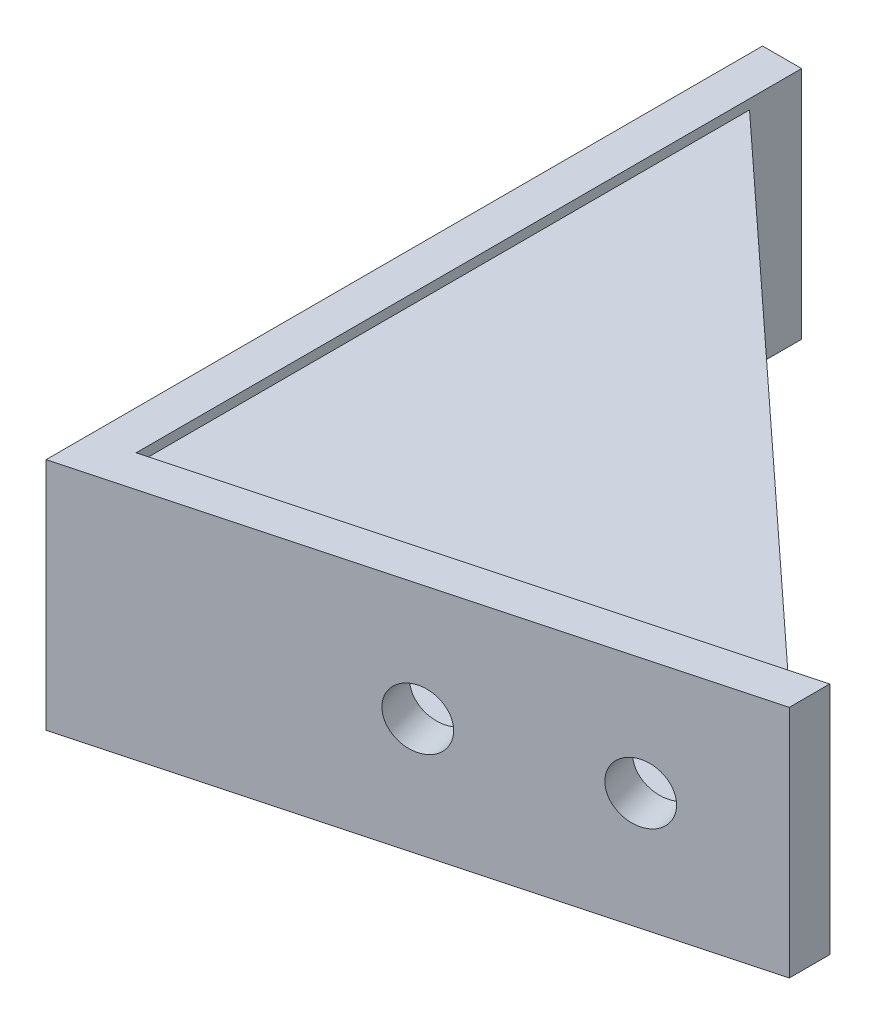
ISO-10303-21;
HEADER;
FILE_DESCRIPTION(('STEP AP214'),'2;1');
FILE_NAME('part.step','',(''),(''),'','','');
FILE_SCHEMA(('AUTOMOTIVE_DESIGN { 1 0 10303 214 1 1 1 1 }'));
ENDSEC;
DATA;
#1=APPLICATION_CONTEXT('core data for automotive mechanical design processes');
#2=APPLICATION_PROTOCOL_DEFINITION('international standard','automotive_design',2000,#1);
#3=PRODUCT_CONTEXT('',#1,'mechanical');
#4=PRODUCT('Part','Part','',(#3));
#5=PRODUCT_RELATED_PRODUCT_CATEGORY('part','',(#4));
#6=PRODUCT_DEFINITION_FORMATION('','',#4);
#7=PRODUCT_DEFINITION_CONTEXT('part definition',#1,'design');
#8=PRODUCT_DEFINITION('design','',#6,#7);
#9=PRODUCT_DEFINITION_SHAPE('','',#8);
#10=(LENGTH_UNIT() NAMED_UNIT(*) SI_UNIT(.MILLI.,.METRE.));
#11=(NAMED_UNIT(*) PLANE_ANGLE_UNIT() SI_UNIT($,.RADIAN.));
#12=(NAMED_UNIT(*) SI_UNIT($,.STERADIAN.) SOLID_ANGLE_UNIT());
#13=UNCERTAINTY_MEASURE_WITH_UNIT(LENGTH_MEASURE(1.E-05),#10,'distance_accuracy_value','');
#14=(GEOMETRIC_REPRESENTATION_CONTEXT(3) GLOBAL_UNCERTAINTY_ASSIGNED_CONTEXT((#13)) GLOBAL_UNIT_ASSIGNED_CONTEXT((#10,
#11,#12)) REPRESENTATION_CONTEXT('',''));
#15=CARTESIAN_POINT('',(0.,0.,0.));
#16=DIRECTION('',(0.,0.,1.));
#17=DIRECTION('',(1.,0.,0.));
#18=AXIS2_PLACEMENT_3D('',#15,#16,#17);
#19=CARTESIAN_POINT('',(82.379679526292,11.5,1934.81014608));
#20=DIRECTION('',(0.,1.,0.));
#21=DIRECTION('',(1.,0.,0.));
#22=AXIS2_PLACEMENT_3D('',#19,#20,#21);
#23=PLANE('',#22);
#24=DIRECTION('',(0.,0.,1.));
#25=VECTOR('',#24,1.);
#26=CARTESIAN_POINT('',(56.,11.5,1881.205080758));
#27=LINE('',#26,#25);
#28=CARTESIAN_POINT('',(56.,11.5,1881.205080758));
#29=VERTEX_POINT('',#28);
#30=CARTESIAN_POINT('',(56.,11.5,1975.385728521));
#31=VERTEX_POINT('',#30);
#32=EDGE_CURVE('E242',#29,#31,#27,.T.);
#33=ORIENTED_EDGE('',*,*,#32,.F.);
#34=DIRECTION('',(-0.734388245571344,0.,-0.678729625673318));
#35=VECTOR('',#34,1.);
#36=CARTESIAN_POINT('',(135.,11.5,1954.217742319));
#37=LINE('',#36,#35);
#38=CARTESIAN_POINT('',(135.,11.5,1954.217742319));
#39=VERTEX_POINT('',#38);
#40=EDGE_CURVE('E11',#39,#29,#37,.T.);
#41=ORIENTED_EDGE('',*,*,#40,.F.);
#42=DIRECTION('',(0.965925826288944,0.,-0.258819045102985));
#43=VECTOR('',#42,1.);
#44=CARTESIAN_POINT('',(56.,11.5,1975.385728521));
#45=LINE('',#44,#43);
#46=EDGE_CURVE('E264',#31,#39,#45,.T.);
#47=ORIENTED_EDGE('',*,*,#46,.F.);
#48=EDGE_LOOP('',(#33,#41,#47));
#49=FACE_BOUND('',#48,.T.);
#50=ADVANCED_FACE('F17',(#49),#23,.F.);
#51=CARTESIAN_POINT('',(135.,11.5,1954.217742319));
#52=DIRECTION('',(-0.678729625673318,0.,0.734388245571344));
#53=DIRECTION('',(0.,1.,0.));
#54=AXIS2_PLACEMENT_3D('',#51,#52,#53);
#55=PLANE('',#54);
#56=ORIENTED_EDGE('',*,*,#40,.T.);
#57=DIRECTION('',(0.,1.,0.));
#58=VECTOR('',#57,1.);
#59=CARTESIAN_POINT('',(56.,11.5,1881.205080758));
#60=LINE('',#59,#58);
#61=CARTESIAN_POINT('',(56.,16.5,1881.205080758));
#62=VERTEX_POINT('',#61);
#63=EDGE_CURVE('E238',#29,#62,#60,.T.);
#64=ORIENTED_EDGE('',*,*,#63,.T.);
#65=DIRECTION('',(-0.734388245571344,0.,-0.678729625673318));
#66=VECTOR('',#65,1.);
#67=CARTESIAN_POINT('',(135.,16.5,1954.217742319));
#68=LINE('',#67,#66);
#69=CARTESIAN_POINT('',(135.,16.5,1954.217742319));
#70=VERTEX_POINT('',#69);
#71=EDGE_CURVE('E20',#70,#62,#68,.T.);
#72=ORIENTED_EDGE('',*,*,#71,.F.);
#73=DIRECTION('',(0.,1.,0.));
#74=VECTOR('',#73,1.);
#75=CARTESIAN_POINT('',(135.,11.5,1954.217742319));
#76=LINE('',#75,#74);
#77=EDGE_CURVE('E268',#39,#70,#76,.T.);
#78=ORIENTED_EDGE('',*,*,#77,.F.);
#79=EDGE_LOOP('',(#56,#64,#72,#78));
#80=FACE_BOUND('',#79,.T.);
#81=ADVANCED_FACE('F396',(#80),#55,.F.);
#82=CARTESIAN_POINT('',(82.379679526292,-11.5,1934.81014608));
#83=DIRECTION('',(0.,1.,0.));
#84=DIRECTION('',(1.,0.,0.));
#85=AXIS2_PLACEMENT_3D('',#82,#83,#84);
#86=PLANE('',#85);
#87=DIRECTION('',(0.965925826288944,0.,-0.258819045102985));
#88=VECTOR('',#87,1.);
#89=CARTESIAN_POINT('',(56.,-11.5,1975.385728521));
#90=LINE('',#89,#88);
#91=CARTESIAN_POINT('',(56.,-11.5,1975.385728521));
#92=VERTEX_POINT('',#91);
#93=CARTESIAN_POINT('',(135.,-11.5,1954.217742319));
#94=VERTEX_POINT('',#93);
#95=EDGE_CURVE('E259',#92,#94,#90,.T.);
#96=ORIENTED_EDGE('',*,*,#95,.T.);
#97=DIRECTION('',(-0.734388245571344,0.,-0.678729625673318));
#98=VECTOR('',#97,1.);
#99=CARTESIAN_POINT('',(135.,-11.5,1954.217742319));
#100=LINE('',#99,#98);
#101=CARTESIAN_POINT('',(56.,-11.5,1881.205080758));
#102=VERTEX_POINT('',#101);
#103=EDGE_CURVE('E48',#94,#102,#100,.T.);
#104=ORIENTED_EDGE('',*,*,#103,.T.);
#105=DIRECTION('',(0.,0.,1.));
#106=VECTOR('',#105,1.);
#107=CARTESIAN_POINT('',(56.,-11.5,1881.205080758));
#108=LINE('',#107,#106);
#109=EDGE_CURVE('E275',#102,#92,#108,.T.);
#110=ORIENTED_EDGE('',*,*,#109,.T.);
#111=EDGE_LOOP('',(#96,#104,#110));
#112=FACE_BOUND('',#111,.T.);
#113=ADVANCED_FACE('F402',(#112),#86,.T.);
#114=CARTESIAN_POINT('',(82.379679526292,16.5,1934.81014608));
#115=DIRECTION('',(0.,1.,0.));
#116=DIRECTION('',(1.,0.,0.));
#117=AXIS2_PLACEMENT_3D('',#114,#115,#116);
#118=PLANE('',#117);
#119=DIRECTION('',(0.965925826288944,0.,-0.258819045102985));
#120=VECTOR('',#119,1.);
#121=CARTESIAN_POINT('',(56.,16.5,1975.385728521));
#122=LINE('',#121,#120);
#123=CARTESIAN_POINT('',(56.,16.5,1975.385728521));
#124=VERTEX_POINT('',#123);
#125=EDGE_CURVE('E224',#124,#70,#122,.T.);
#126=ORIENTED_EDGE('',*,*,#125,.T.);
#127=ORIENTED_EDGE('',*,*,#71,.T.);
#128=DIRECTION('',(0.,0.,1.));
#129=VECTOR('',#128,1.);
#130=CARTESIAN_POINT('',(56.,16.5,1881.205080758));
#131=LINE('',#130,#129);
#132=EDGE_CURVE('E194',#62,#124,#131,.T.);
#133=ORIENTED_EDGE('',*,*,#132,.T.);
#134=EDGE_LOOP('',(#126,#127,#133));
#135=FACE_BOUND('',#134,.T.);
#136=ADVANCED_FACE('F418',(#135),#118,.T.);
#137=CARTESIAN_POINT('',(135.,-16.5,1954.217742319));
#138=DIRECTION('',(-0.678729625673318,0.,0.734388245571344));
#139=DIRECTION('',(0.,1.,0.));
#140=AXIS2_PLACEMENT_3D('',#137,#138,#139);
#141=PLANE('',#140);
#142=DIRECTION('',(-0.734388245571344,0.,-0.678729625673318));
#143=VECTOR('',#142,1.);
#144=CARTESIAN_POINT('',(135.,-16.5,1954.217742319));
#145=LINE('',#144,#143);
#146=CARTESIAN_POINT('',(135.,-16.5,1954.217742319));
#147=VERTEX_POINT('',#146);
#148=CARTESIAN_POINT('',(56.,-16.5,1881.205080758));
#149=VERTEX_POINT('',#148);
#150=EDGE_CURVE('E38',#147,#149,#145,.T.);
#151=ORIENTED_EDGE('',*,*,#150,.T.);
#152=DIRECTION('',(0.,1.,0.));
#153=VECTOR('',#152,1.);
#154=CARTESIAN_POINT('',(56.,-16.5,1881.205080758));
#155=LINE('',#154,#153);
#156=EDGE_CURVE('E278',#149,#102,#155,.T.);
#157=ORIENTED_EDGE('',*,*,#156,.T.);
#158=ORIENTED_EDGE('',*,*,#103,.F.);
#159=DIRECTION('',(0.,1.,0.));
#160=VECTOR('',#159,1.);
#161=CARTESIAN_POINT('',(135.,-16.5,1954.217742319));
#162=LINE('',#161,#160);
#163=EDGE_CURVE('E255',#147,#94,#162,.T.);
#164=ORIENTED_EDGE('',*,*,#163,.F.);
#165=EDGE_LOOP('',(#151,#157,#158,#164));
#166=FACE_BOUND('',#165,.T.);
#167=ADVANCED_FACE('F416',(#166),#141,.F.);
#168=CARTESIAN_POINT('',(82.379679526292,-16.5,1934.81014608));
#169=DIRECTION('',(0.,1.,0.));
#170=DIRECTION('',(1.,0.,0.));
#171=AXIS2_PLACEMENT_3D('',#168,#169,#170);
#172=PLANE('',#171);
#173=DIRECTION('',(0.,0.,1.));
#174=VECTOR('',#173,1.);
#175=CARTESIAN_POINT('',(56.,-16.5,1881.205080758));
#176=LINE('',#175,#174);
#177=CARTESIAN_POINT('',(56.,-16.5,1975.385728521));
#178=VERTEX_POINT('',#177);
#179=EDGE_CURVE('E281',#149,#178,#176,.T.);
#180=ORIENTED_EDGE('',*,*,#179,.F.);
#181=ORIENTED_EDGE('',*,*,#150,.F.);
#182=DIRECTION('',(0.965925826288944,0.,-0.258819045102985));
#183=VECTOR('',#182,1.);
#184=CARTESIAN_POINT('',(56.,-16.5,1975.385728521));
#185=LINE('',#184,#183);
#186=EDGE_CURVE('E251',#178,#147,#185,.T.);
#187=ORIENTED_EDGE('',*,*,#186,.F.);
#188=EDGE_LOOP('',(#180,#181,#187));
#189=FACE_BOUND('',#188,.T.);
#190=ADVANCED_FACE('F390',(#189),#172,.F.);
#191=CARTESIAN_POINT('',(56.,-18.,1975.385728521));
#192=DIRECTION('',(-1.,0.,0.));
#193=DIRECTION('',(0.,0.,1.));
#194=AXIS2_PLACEMENT_3D('',#191,#192,#193);
#195=PLANE('',#194);
#196=CARTESIAN_POINT('',(56.,0.,1893.205080758));
#197=DIRECTION('',(1.,0.,0.));
#198=DIRECTION('',(0.,0.,1.));
#199=AXIS2_PLACEMENT_3D('',#196,#197,#198);
#200=CIRCLE('',#199,4.5);
#201=CARTESIAN_POINT('',(56.,0.,1897.705080758));
#202=VERTEX_POINT('',#201);
#203=EDGE_CURVE('E173',#202,#202,#200,.T.);
#204=ORIENTED_EDGE('',*,*,#203,.F.);
#205=EDGE_LOOP('',(#204));
#206=FACE_BOUND('',#205,.T.);
#207=CARTESIAN_POINT('',(56.,0.,1933.205080758));
#208=DIRECTION('',(1.,0.,0.));
#209=DIRECTION('',(0.,0.,1.));
#210=AXIS2_PLACEMENT_3D('',#207,#208,#209);
#211=CIRCLE('',#210,4.5);
#212=CARTESIAN_POINT('',(56.,0.,1937.705080758));
#213=VERTEX_POINT('',#212);
#214=EDGE_CURVE('E207',#213,#213,#211,.T.);
#215=ORIENTED_EDGE('',*,*,#214,.F.);
#216=EDGE_LOOP('',(#215));
#217=FACE_BOUND('',#216,.T.);
#218=DIRECTION('',(0.,1.,0.));
#219=VECTOR('',#218,1.);
#220=CARTESIAN_POINT('',(56.,-18.,1873.205080758));
#221=LINE('',#220,#219);
#222=CARTESIAN_POINT('',(56.,-18.,1873.205080758));
#223=VERTEX_POINT('',#222);
#224=CARTESIAN_POINT('',(56.,18.,1873.205080758));
#225=VERTEX_POINT('',#224);
#226=EDGE_CURVE('E175',#223,#225,#221,.T.);
#227=ORIENTED_EDGE('',*,*,#226,.T.);
#228=DIRECTION('',(0.,0.,-1.));
#229=VECTOR('',#228,1.);
#230=CARTESIAN_POINT('',(56.,18.,1975.385728521));
#231=LINE('',#230,#229);
#232=CARTESIAN_POINT('',(56.,18.,1975.385728521));
#233=VERTEX_POINT('',#232);
#234=EDGE_CURVE('E215',#233,#225,#231,.T.);
#235=ORIENTED_EDGE('',*,*,#234,.F.);
#236=DIRECTION('',(0.,1.,0.));
#237=VECTOR('',#236,1.);
#238=CARTESIAN_POINT('',(56.,-18.,1975.385728521));
#239=LINE('',#238,#237);
#240=EDGE_CURVE('E221',#124,#233,#239,.T.);
#241=ORIENTED_EDGE('',*,*,#240,.F.);
#242=ORIENTED_EDGE('',*,*,#132,.F.);
#243=ORIENTED_EDGE('',*,*,#63,.F.);
#244=ORIENTED_EDGE('',*,*,#32,.T.);
#245=DIRECTION('',(0.,1.,0.));
#246=VECTOR('',#245,1.);
#247=CARTESIAN_POINT('',(56.,-18.,1975.385728521));
#248=LINE('',#247,#246);
#249=EDGE_CURVE('E260',#92,#31,#248,.T.);
#250=ORIENTED_EDGE('',*,*,#249,.F.);
#251=ORIENTED_EDGE('',*,*,#109,.F.);
#252=ORIENTED_EDGE('',*,*,#156,.F.);
#253=ORIENTED_EDGE('',*,*,#179,.T.);
#254=DIRECTION('',(0.,1.,0.));
#255=VECTOR('',#254,1.);
#256=CARTESIAN_POINT('',(56.,-18.,1975.385728521));
#257=LINE('',#256,#255);
#258=CARTESIAN_POINT('',(56.,-18.,1975.385728521));
#259=VERTEX_POINT('',#258);
#260=EDGE_CURVE('E247',#259,#178,#257,.T.);
#261=ORIENTED_EDGE('',*,*,#260,.F.);
#262=DIRECTION('',(0.,0.,-1.));
#263=VECTOR('',#262,1.);
#264=CARTESIAN_POINT('',(56.,-18.,1975.385728521));
#265=LINE('',#264,#263);
#266=EDGE_CURVE('E202',#259,#223,#265,.T.);
#267=ORIENTED_EDGE('',*,*,#266,.T.);
#268=EDGE_LOOP('',(#227,#235,#241,#242,#243,#244,#250,#251,#252,#253,#261,#267));
#269=FACE_BOUND('',#268,.T.);
#270=ADVANCED_FACE('F380',(#206,#217,#269),#195,.F.);
#271=CARTESIAN_POINT('',(140.,-18.,1952.877996357));
#272=DIRECTION('',(0.258819045102985,0.,0.965925826288944));
#273=DIRECTION('',(0.,-1.,0.));
#274=AXIS2_PLACEMENT_3D('',#271,#272,#273);
#275=PLANE('',#274);
#276=CARTESIAN_POINT('',(93.447085729385,0.,1965.351812141));
#277=DIRECTION('',(0.258819045102985,0.,0.965925826288944));
#278=DIRECTION('',(0.965925826288944,0.,-0.258819045102985));
#279=AXIS2_PLACEMENT_3D('',#276,#277,#278);
#280=CIRCLE('',#279,4.5);
#281=CARTESIAN_POINT('',(97.793751947686,0.,1964.187126438));
#282=VERTEX_POINT('',#281);
#283=EDGE_CURVE('E231',#282,#282,#280,.T.);
#284=ORIENTED_EDGE('',*,*,#283,.T.);
#285=EDGE_LOOP('',(#284));
#286=FACE_BOUND('',#285,.T.);
#287=CARTESIAN_POINT('',(120.44708572938,0.,1958.117183945));
#288=DIRECTION('',(0.258819045102985,0.,0.965925826288944));
#289=DIRECTION('',(0.965925826288944,0.,-0.258819045102985));
#290=AXIS2_PLACEMENT_3D('',#287,#288,#289);
#291=CIRCLE('',#290,4.5);
#292=CARTESIAN_POINT('',(124.79375194768,0.,1956.952498242));
#293=VERTEX_POINT('',#292);
#294=EDGE_CURVE('E235',#293,#293,#291,.T.);
#295=ORIENTED_EDGE('',*,*,#294,.T.);
#296=EDGE_LOOP('',(#295));
#297=FACE_BOUND('',#296,.T.);
#298=ORIENTED_EDGE('',*,*,#260,.T.);
#299=ORIENTED_EDGE('',*,*,#186,.T.);
#300=ORIENTED_EDGE('',*,*,#163,.T.);
#301=ORIENTED_EDGE('',*,*,#95,.F.);
#302=ORIENTED_EDGE('',*,*,#249,.T.);
#303=ORIENTED_EDGE('',*,*,#46,.T.);
#304=ORIENTED_EDGE('',*,*,#77,.T.);
#305=ORIENTED_EDGE('',*,*,#125,.F.);
#306=ORIENTED_EDGE('',*,*,#240,.T.);
#307=DIRECTION('',(-0.965925826288944,0.,0.258819045102985));
#308=VECTOR('',#307,1.);
#309=CARTESIAN_POINT('',(140.,18.,1952.877996357));
#310=LINE('',#309,#308);
#311=CARTESIAN_POINT('',(140.,18.,1952.877996357));
#312=VERTEX_POINT('',#311);
#313=EDGE_CURVE('E211',#312,#233,#310,.T.);
#314=ORIENTED_EDGE('',*,*,#313,.F.);
#315=DIRECTION('',(0.,1.,0.));
#316=VECTOR('',#315,1.);
#317=CARTESIAN_POINT('',(140.,-18.,1952.877996357));
#318=LINE('',#317,#316);
#319=CARTESIAN_POINT('',(140.,-18.,1952.877996357));
#320=VERTEX_POINT('',#319);
#321=EDGE_CURVE('E227',#320,#312,#318,.T.);
#322=ORIENTED_EDGE('',*,*,#321,.F.);
#323=DIRECTION('',(-0.965925826288944,0.,0.258819045102985));
#324=VECTOR('',#323,1.);
#325=CARTESIAN_POINT('',(140.,-18.,1952.877996357));
#326=LINE('',#325,#324);
#327=EDGE_CURVE('E197',#320,#259,#326,.T.);
#328=ORIENTED_EDGE('',*,*,#327,.T.);
#329=EDGE_LOOP('',(#298,#299,#300,#301,#302,#303,#304,#305,#306,#314,#322,#328));
#330=FACE_BOUND('',#329,.T.);
#331=ADVANCED_FACE('F341',(#286,#297,#330),#275,.F.);
#332=CARTESIAN_POINT('',(49.,0.,1933.205080758));
#333=DIRECTION('',(1.,0.,0.));
#334=DIRECTION('',(0.,0.,1.));
#335=AXIS2_PLACEMENT_3D('',#332,#333,#334);
#336=CYLINDRICAL_SURFACE('',#335,4.5);
#337=DIRECTION('',(1.,0.,0.));
#338=VECTOR('',#337,1.);
#339=CARTESIAN_POINT('',(49.,0.,1937.705080758));
#340=LINE('',#339,#338);
#341=CARTESIAN_POINT('',(50.,0.,1937.705080758));
#342=VERTEX_POINT('',#341);
#343=EDGE_CURVE('E203',#342,#213,#340,.T.);
#344=ORIENTED_EDGE('',*,*,#343,.F.);
#345=CARTESIAN_POINT('',(50.,0.,1933.205080758));
#346=DIRECTION('',(1.,0.,0.));
#347=DIRECTION('',(0.,0.,1.));
#348=AXIS2_PLACEMENT_3D('',#345,#346,#347);
#349=CIRCLE('',#348,4.5);
#350=EDGE_CURVE('E181',#342,#342,#349,.T.);
#351=ORIENTED_EDGE('',*,*,#350,.F.);
#352=ORIENTED_EDGE('',*,*,#343,.T.);
#353=ORIENTED_EDGE('',*,*,#214,.T.);
#354=EDGE_LOOP('',(#344,#351,#352,#353));
#355=FACE_BOUND('',#354,.T.);
#356=ADVANCED_FACE('F379',(#355),#336,.F.);
#357=CARTESIAN_POINT('',(49.,0.,1893.205080758));
#358=DIRECTION('',(1.,0.,0.));
#359=DIRECTION('',(0.,0.,1.));
#360=AXIS2_PLACEMENT_3D('',#357,#358,#359);
#361=CYLINDRICAL_SURFACE('',#360,4.5);
#362=DIRECTION('',(1.,0.,0.));
#363=VECTOR('',#362,1.);
#364=CARTESIAN_POINT('',(49.,0.,1897.705080758));
#365=LINE('',#364,#363);
#366=CARTESIAN_POINT('',(50.,0.,1897.705080758));
#367=VERTEX_POINT('',#366);
#368=EDGE_CURVE('E168',#367,#202,#365,.T.);
#369=ORIENTED_EDGE('',*,*,#368,.F.);
#370=CARTESIAN_POINT('',(50.,0.,1893.205080758));
#371=DIRECTION('',(1.,0.,0.));
#372=DIRECTION('',(0.,0.,1.));
#373=AXIS2_PLACEMENT_3D('',#370,#371,#372);
#374=CIRCLE('',#373,4.5);
#375=EDGE_CURVE('E171',#367,#367,#374,.T.);
#376=ORIENTED_EDGE('',*,*,#375,.F.);
#377=ORIENTED_EDGE('',*,*,#368,.T.);
#378=ORIENTED_EDGE('',*,*,#203,.T.);
#379=EDGE_LOOP('',(#369,#376,#377,#378));
#380=FACE_BOUND('',#379,.T.);
#381=ADVANCED_FACE('F170',(#380),#361,.F.);
#382=CARTESIAN_POINT('',(56.,-18.,1873.205080758));
#383=DIRECTION('',(0.,0.,1.));
#384=DIRECTION('',(1.,0.,0.));
#385=AXIS2_PLACEMENT_3D('',#382,#383,#384);
#386=PLANE('',#385);
#387=DIRECTION('',(-1.,0.,0.));
#388=VECTOR('',#387,1.);
#389=CARTESIAN_POINT('',(56.,-18.,1873.205080758));
#390=LINE('',#389,#388);
#391=CARTESIAN_POINT('',(50.,-18.,1873.205080758));
#392=VERTEX_POINT('',#391);
#393=EDGE_CURVE('E188',#223,#392,#390,.T.);
#394=ORIENTED_EDGE('',*,*,#393,.T.);
#395=DIRECTION('',(0.,1.,0.));
#396=VECTOR('',#395,1.);
#397=CARTESIAN_POINT('',(50.,-18.,1873.205080758));
#398=LINE('',#397,#396);
#399=CARTESIAN_POINT('',(50.,18.,1873.205080758));
#400=VERTEX_POINT('',#399);
#401=EDGE_CURVE('E191',#392,#400,#398,.T.);
#402=ORIENTED_EDGE('',*,*,#401,.T.);
#403=DIRECTION('',(-1.,0.,0.));
#404=VECTOR('',#403,1.);
#405=CARTESIAN_POINT('',(56.,18.,1873.205080758));
#406=LINE('',#405,#404);
#407=EDGE_CURVE('E220',#225,#400,#406,.T.);
#408=ORIENTED_EDGE('',*,*,#407,.F.);
#409=ORIENTED_EDGE('',*,*,#226,.F.);
#410=EDGE_LOOP('',(#394,#402,#408,#409));
#411=FACE_BOUND('',#410,.T.);
#412=ADVANCED_FACE('F529',(#411),#386,.F.);
#413=CARTESIAN_POINT('',(120.18826668428,0.,1957.151258119));
#414=DIRECTION('',(0.258819045102985,0.,0.965925826288944));
#415=DIRECTION('',(0.965925826288944,0.,-0.258819045102985));
#416=AXIS2_PLACEMENT_3D('',#413,#414,#415);
#417=CYLINDRICAL_SURFACE('',#416,4.5);
#418=DIRECTION('',(0.258819045102985,0.,0.965925826288944));
#419=VECTOR('',#418,1.);
#420=CARTESIAN_POINT('',(124.53493290258,0.,1955.986572416));
#421=LINE('',#420,#419);
#422=CARTESIAN_POINT('',(126.3466662183,0.,1962.7480532));
#423=VERTEX_POINT('',#422);
#424=EDGE_CURVE('E232',#293,#423,#421,.T.);
#425=ORIENTED_EDGE('',*,*,#424,.F.);
#426=ORIENTED_EDGE('',*,*,#294,.F.);
#427=ORIENTED_EDGE('',*,*,#424,.T.);
#428=CARTESIAN_POINT('',(122.,0.,1963.912738903));
#429=DIRECTION('',(0.258819045102985,0.,0.965925826288944));
#430=DIRECTION('',(0.965925826288944,0.,-0.258819045102985));
#431=AXIS2_PLACEMENT_3D('',#428,#429,#430);
#432=CIRCLE('',#431,4.5);
#433=EDGE_CURVE('E305',#423,#423,#432,.T.);
#434=ORIENTED_EDGE('',*,*,#433,.T.);
#435=EDGE_LOOP('',(#425,#426,#427,#434));
#436=FACE_BOUND('',#435,.T.);
#437=ADVANCED_FACE('F366',(#436),#417,.F.);
#438=CARTESIAN_POINT('',(93.188266684282,0.,1964.385886315));
#439=DIRECTION('',(0.258819045102985,0.,0.965925826288944));
#440=DIRECTION('',(0.965925826288944,0.,-0.258819045102985));
#441=AXIS2_PLACEMENT_3D('',#438,#439,#440);
#442=CYLINDRICAL_SURFACE('',#441,4.5);
#443=DIRECTION('',(0.258819045102985,0.,0.965925826288944));
#444=VECTOR('',#443,1.);
#445=CARTESIAN_POINT('',(97.534932902583,0.,1963.221200612));
#446=LINE('',#445,#444);
#447=CARTESIAN_POINT('',(99.346666218301,0.,1969.982681396));
#448=VERTEX_POINT('',#447);
#449=EDGE_CURVE('E228',#282,#448,#446,.T.);
#450=ORIENTED_EDGE('',*,*,#449,.F.);
#451=ORIENTED_EDGE('',*,*,#283,.F.);
#452=ORIENTED_EDGE('',*,*,#449,.T.);
#453=CARTESIAN_POINT('',(95.,0.,1971.147367099));
#454=DIRECTION('',(0.258819045102985,0.,0.965925826288944));
#455=DIRECTION('',(0.965925826288944,0.,-0.258819045102985));
#456=AXIS2_PLACEMENT_3D('',#453,#454,#455);
#457=CIRCLE('',#456,4.5);
#458=EDGE_CURVE('E306',#448,#448,#457,.T.);
#459=ORIENTED_EDGE('',*,*,#458,.T.);
#460=EDGE_LOOP('',(#450,#451,#452,#459));
#461=FACE_BOUND('',#460,.T.);
#462=ADVANCED_FACE('F375',(#461),#442,.F.);
#463=CARTESIAN_POINT('',(140.,-18.,1959.089653439));
#464=DIRECTION('',(-1.,0.,0.));
#465=DIRECTION('',(0.,0.,1.));
#466=AXIS2_PLACEMENT_3D('',#463,#464,#465);
#467=PLANE('',#466);
#468=DIRECTION('',(0.,0.,-1.));
#469=VECTOR('',#468,1.);
#470=CARTESIAN_POINT('',(140.,-18.,1959.089653439));
#471=LINE('',#470,#469);
#472=CARTESIAN_POINT('',(140.,-18.,1959.089653439));
#473=VERTEX_POINT('',#472);
#474=EDGE_CURVE('E201',#473,#320,#471,.T.);
#475=ORIENTED_EDGE('',*,*,#474,.T.);
#476=ORIENTED_EDGE('',*,*,#321,.T.);
#477=DIRECTION('',(0.,0.,-1.));
#478=VECTOR('',#477,1.);
#479=CARTESIAN_POINT('',(140.,18.,1959.089653439));
#480=LINE('',#479,#478);
#481=CARTESIAN_POINT('',(140.,18.,1959.089653439));
#482=VERTEX_POINT('',#481);
#483=EDGE_CURVE('E216',#482,#312,#480,.T.);
#484=ORIENTED_EDGE('',*,*,#483,.F.);
#485=DIRECTION('',(0.,1.,0.));
#486=VECTOR('',#485,1.);
#487=CARTESIAN_POINT('',(140.,-18.,1959.089653439));
#488=LINE('',#487,#486);
#489=EDGE_CURVE('E293',#473,#482,#488,.T.);
#490=ORIENTED_EDGE('',*,*,#489,.F.);
#491=EDGE_LOOP('',(#475,#476,#484,#490));
#492=FACE_BOUND('',#491,.T.);
#493=ADVANCED_FACE('F330',(#492),#467,.F.);
#494=CARTESIAN_POINT('',(95.,18.,1968.041538557));
#495=DIRECTION('',(0.,1.,0.));
#496=DIRECTION('',(1.,0.,0.));
#497=AXIS2_PLACEMENT_3D('',#494,#495,#496);
#498=PLANE('',#497);
#499=DIRECTION('',(0.965925826288944,0.,-0.258819045102985));
#500=VECTOR('',#499,1.);
#501=CARTESIAN_POINT('',(50.,18.,1983.205080758));
#502=LINE('',#501,#500);
#503=CARTESIAN_POINT('',(50.,18.,1983.205080758));
#504=VERTEX_POINT('',#503);
#505=EDGE_CURVE('E296',#504,#482,#502,.T.);
#506=ORIENTED_EDGE('',*,*,#505,.T.);
#507=ORIENTED_EDGE('',*,*,#483,.T.);
#508=ORIENTED_EDGE('',*,*,#313,.T.);
#509=ORIENTED_EDGE('',*,*,#234,.T.);
#510=ORIENTED_EDGE('',*,*,#407,.T.);
#511=DIRECTION('',(0.,0.,-1.));
#512=VECTOR('',#511,1.);
#513=CARTESIAN_POINT('',(50.,18.,1983.205080758));
#514=LINE('',#513,#512);
#515=EDGE_CURVE('E301',#504,#400,#514,.T.);
#516=ORIENTED_EDGE('',*,*,#515,.F.);
#517=EDGE_LOOP('',(#506,#507,#508,#509,#510,#516));
#518=FACE_BOUND('',#517,.T.);
#519=ADVANCED_FACE('F346',(#518),#498,.T.);
#520=CARTESIAN_POINT('',(95.,-18.,1968.041538557));
#521=DIRECTION('',(0.,1.,0.));
#522=DIRECTION('',(1.,0.,0.));
#523=AXIS2_PLACEMENT_3D('',#520,#521,#522);
#524=PLANE('',#523);
#525=DIRECTION('',(0.,0.,1.));
#526=VECTOR('',#525,1.);
#527=CARTESIAN_POINT('',(50.,-18.,1873.205080758));
#528=LINE('',#527,#526);
#529=CARTESIAN_POINT('',(50.,-18.,1983.205080758));
#530=VERTEX_POINT('',#529);
#531=EDGE_CURVE('E182',#392,#530,#528,.T.);
#532=ORIENTED_EDGE('',*,*,#531,.F.);
#533=ORIENTED_EDGE('',*,*,#393,.F.);
#534=ORIENTED_EDGE('',*,*,#266,.F.);
#535=ORIENTED_EDGE('',*,*,#327,.F.);
#536=ORIENTED_EDGE('',*,*,#474,.F.);
#537=DIRECTION('',(0.965925826288944,0.,-0.258819045102985));
#538=VECTOR('',#537,1.);
#539=CARTESIAN_POINT('',(50.,-18.,1983.205080758));
#540=LINE('',#539,#538);
#541=EDGE_CURVE('E352',#530,#473,#540,.T.);
#542=ORIENTED_EDGE('',*,*,#541,.F.);
#543=EDGE_LOOP('',(#532,#533,#534,#535,#536,#542));
#544=FACE_BOUND('',#543,.T.);
#545=ADVANCED_FACE('F338',(#544),#524,.F.);
#546=CARTESIAN_POINT('',(50.,-18.,1976.993423676));
#547=DIRECTION('',(1.,0.,0.));
#548=DIRECTION('',(0.,1.,0.));
#549=AXIS2_PLACEMENT_3D('',#546,#547,#548);
#550=PLANE('',#549);
#551=ORIENTED_EDGE('',*,*,#350,.T.);
#552=EDGE_LOOP('',(#551));
#553=FACE_BOUND('',#552,.T.);
#554=ORIENTED_EDGE('',*,*,#375,.T.);
#555=EDGE_LOOP('',(#554));
#556=FACE_BOUND('',#555,.T.);
#557=ORIENTED_EDGE('',*,*,#515,.T.);
#558=ORIENTED_EDGE('',*,*,#401,.F.);
#559=ORIENTED_EDGE('',*,*,#531,.T.);
#560=DIRECTION('',(0.,1.,0.));
#561=VECTOR('',#560,1.);
#562=CARTESIAN_POINT('',(50.,-18.,1983.205080758));
#563=LINE('',#562,#561);
#564=EDGE_CURVE('E300',#530,#504,#563,.T.);
#565=ORIENTED_EDGE('',*,*,#564,.T.);
#566=EDGE_LOOP('',(#557,#558,#559,#565));
#567=FACE_BOUND('',#566,.T.);
#568=ADVANCED_FACE('F178',(#553,#556,#567),#550,.F.);
#569=CARTESIAN_POINT('',(50.,-18.,1983.205080758));
#570=DIRECTION('',(-0.258819045102985,0.,-0.965925826288944));
#571=DIRECTION('',(-0.965925826288944,0.,0.258819045102985));
#572=AXIS2_PLACEMENT_3D('',#569,#570,#571);
#573=PLANE('',#572);
#574=ORIENTED_EDGE('',*,*,#433,.F.);
#575=EDGE_LOOP('',(#574));
#576=FACE_BOUND('',#575,.T.);
#577=ORIENTED_EDGE('',*,*,#458,.F.);
#578=EDGE_LOOP('',(#577));
#579=FACE_BOUND('',#578,.T.);
#580=ORIENTED_EDGE('',*,*,#541,.T.);
#581=ORIENTED_EDGE('',*,*,#489,.T.);
#582=ORIENTED_EDGE('',*,*,#505,.F.);
#583=ORIENTED_EDGE('',*,*,#564,.F.);
#584=EDGE_LOOP('',(#580,#581,#582,#583));
#585=FACE_BOUND('',#584,.T.);
#586=ADVANCED_FACE('F351',(#576,#579,#585),#573,.F.);
#587=CLOSED_SHELL('',(#50,#81,#113,#136,#167,#190,#270,#331,#356,#381,#412,#437,#462,#493,#519,
#545,#568,#586));
#588=MANIFOLD_SOLID_BREP('B1',#587);
#589=ADVANCED_BREP_SHAPE_REPRESENTATION('',(#18,#588),#14);
#590=SHAPE_DEFINITION_REPRESENTATION(#9,#589);
ENDSEC;
END-ISO-10303-21;
